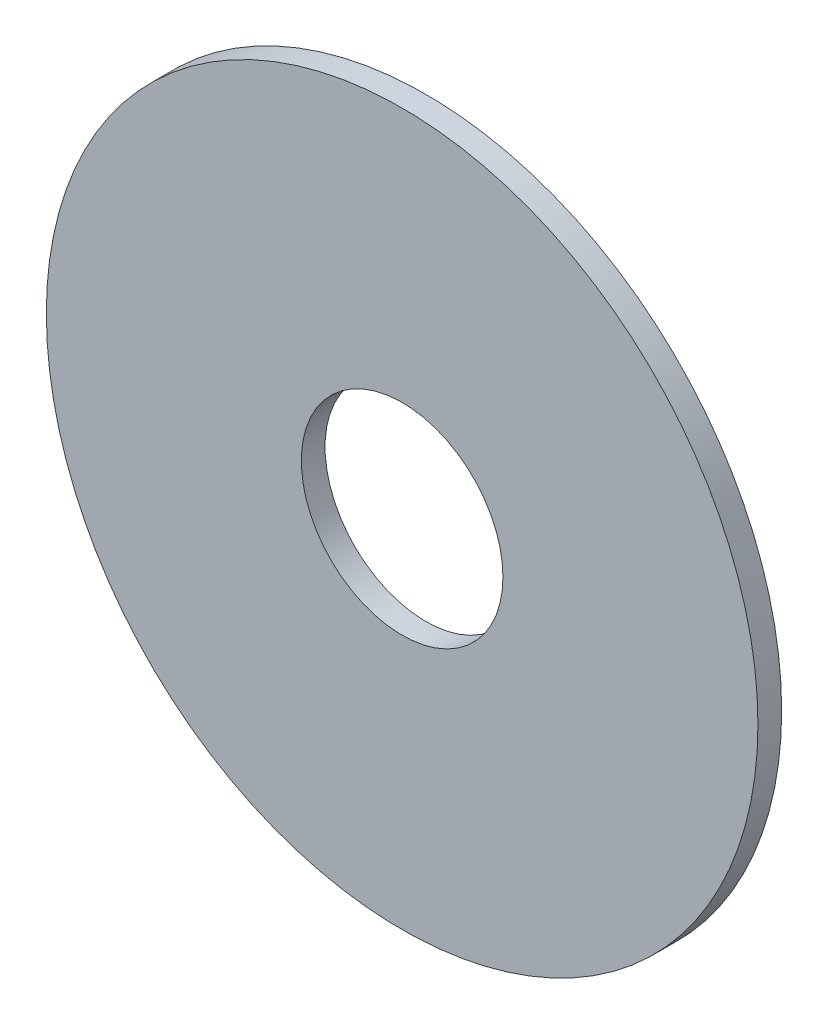
ISO-10303-21;
HEADER;
FILE_DESCRIPTION(('STEP AP214'),'2;1');
FILE_NAME('part.step','',(''),(''),'','','');
FILE_SCHEMA(('AUTOMOTIVE_DESIGN { 1 0 10303 214 1 1 1 1 }'));
ENDSEC;
DATA;
#1=APPLICATION_CONTEXT('core data for automotive mechanical design processes');
#2=APPLICATION_PROTOCOL_DEFINITION('international standard','automotive_design',2000,#1);
#3=PRODUCT_CONTEXT('',#1,'mechanical');
#4=PRODUCT('Part','Part','',(#3));
#5=PRODUCT_RELATED_PRODUCT_CATEGORY('part','',(#4));
#6=PRODUCT_DEFINITION_FORMATION('','',#4);
#7=PRODUCT_DEFINITION_CONTEXT('part definition',#1,'design');
#8=PRODUCT_DEFINITION('design','',#6,#7);
#9=PRODUCT_DEFINITION_SHAPE('','',#8);
#10=(LENGTH_UNIT() NAMED_UNIT(*) SI_UNIT(.MILLI.,.METRE.));
#11=(NAMED_UNIT(*) PLANE_ANGLE_UNIT() SI_UNIT($,.RADIAN.));
#12=(NAMED_UNIT(*) SI_UNIT($,.STERADIAN.) SOLID_ANGLE_UNIT());
#13=UNCERTAINTY_MEASURE_WITH_UNIT(LENGTH_MEASURE(1.E-05),#10,'distance_accuracy_value','');
#14=(GEOMETRIC_REPRESENTATION_CONTEXT(3) GLOBAL_UNCERTAINTY_ASSIGNED_CONTEXT((#13)) GLOBAL_UNIT_ASSIGNED_CONTEXT((#10,
#11,#12)) REPRESENTATION_CONTEXT('',''));
#15=CARTESIAN_POINT('',(0.,0.,0.));
#16=DIRECTION('',(0.,0.,1.));
#17=DIRECTION('',(1.,0.,0.));
#18=AXIS2_PLACEMENT_3D('',#15,#16,#17);
#19=CARTESIAN_POINT('',(0.,0.,1.));
#20=DIRECTION('',(0.,0.,1.));
#21=DIRECTION('',(1.,0.,0.));
#22=AXIS2_PLACEMENT_3D('',#19,#20,#21);
#23=PLANE('',#22);
#24=CARTESIAN_POINT('',(0.,0.,1.));
#25=DIRECTION('',(0.,0.,1.));
#26=DIRECTION('',(1.,0.,0.));
#27=AXIS2_PLACEMENT_3D('',#24,#25,#26);
#28=CIRCLE('',#27,15.);
#29=CARTESIAN_POINT('',(15.,0.,1.));
#30=VERTEX_POINT('',#29);
#31=EDGE_CURVE('E10',#30,#30,#28,.T.);
#32=ORIENTED_EDGE('',*,*,#31,.T.);
#33=EDGE_LOOP('',(#32));
#34=FACE_BOUND('',#33,.T.);
#35=CARTESIAN_POINT('',(0.,0.,1.));
#36=DIRECTION('',(0.,0.,1.));
#37=DIRECTION('',(1.,0.,0.));
#38=AXIS2_PLACEMENT_3D('',#35,#36,#37);
#39=CIRCLE('',#38,4.25);
#40=CARTESIAN_POINT('',(4.25,0.,1.));
#41=VERTEX_POINT('',#40);
#42=EDGE_CURVE('E50',#41,#41,#39,.T.);
#43=ORIENTED_EDGE('',*,*,#42,.F.);
#44=EDGE_LOOP('',(#43));
#45=FACE_BOUND('',#44,.T.);
#46=ADVANCED_FACE('F37',(#34,#45),#23,.T.);
#47=CARTESIAN_POINT('',(0.,0.,0.));
#48=DIRECTION('',(0.,0.,1.));
#49=DIRECTION('',(1.,0.,0.));
#50=AXIS2_PLACEMENT_3D('',#47,#48,#49);
#51=PLANE('',#50);
#52=CARTESIAN_POINT('',(0.,0.,0.));
#53=DIRECTION('',(0.,0.,1.));
#54=DIRECTION('',(1.,0.,0.));
#55=AXIS2_PLACEMENT_3D('',#52,#53,#54);
#56=CIRCLE('',#55,15.);
#57=CARTESIAN_POINT('',(15.,0.,0.));
#58=VERTEX_POINT('',#57);
#59=EDGE_CURVE('E41',#58,#58,#56,.T.);
#60=ORIENTED_EDGE('',*,*,#59,.F.);
#61=EDGE_LOOP('',(#60));
#62=FACE_BOUND('',#61,.T.);
#63=CARTESIAN_POINT('',(0.,0.,0.));
#64=DIRECTION('',(0.,0.,1.));
#65=DIRECTION('',(1.,0.,0.));
#66=AXIS2_PLACEMENT_3D('',#63,#64,#65);
#67=CIRCLE('',#66,4.25);
#68=CARTESIAN_POINT('',(4.25,0.,0.));
#69=VERTEX_POINT('',#68);
#70=EDGE_CURVE('E52',#69,#69,#67,.T.);
#71=ORIENTED_EDGE('',*,*,#70,.T.);
#72=EDGE_LOOP('',(#71));
#73=FACE_BOUND('',#72,.T.);
#74=ADVANCED_FACE('F64',(#62,#73),#51,.F.);
#75=CARTESIAN_POINT('',(0.,0.,1.));
#76=DIRECTION('',(0.,0.,-1.));
#77=DIRECTION('',(-1.,0.,0.));
#78=AXIS2_PLACEMENT_3D('',#75,#76,#77);
#79=CYLINDRICAL_SURFACE('',#78,15.);
#80=ORIENTED_EDGE('',*,*,#31,.F.);
#81=EDGE_LOOP('',(#80));
#82=FACE_BOUND('',#81,.T.);
#83=ORIENTED_EDGE('',*,*,#59,.T.);
#84=EDGE_LOOP('',(#83));
#85=FACE_BOUND('',#84,.T.);
#86=ADVANCED_FACE('F39',(#82,#85),#79,.T.);
#87=CARTESIAN_POINT('',(0.,0.,1.));
#88=DIRECTION('',(0.,0.,-1.));
#89=DIRECTION('',(-1.,0.,0.));
#90=AXIS2_PLACEMENT_3D('',#87,#88,#89);
#91=CYLINDRICAL_SURFACE('',#90,4.25);
#92=ORIENTED_EDGE('',*,*,#42,.T.);
#93=EDGE_LOOP('',(#92));
#94=FACE_BOUND('',#93,.T.);
#95=ORIENTED_EDGE('',*,*,#70,.F.);
#96=EDGE_LOOP('',(#95));
#97=FACE_BOUND('',#96,.T.);
#98=ADVANCED_FACE('F60',(#94,#97),#91,.F.);
#99=CLOSED_SHELL('',(#46,#74,#86,#98));
#100=MANIFOLD_SOLID_BREP('B2',#99);
#101=ADVANCED_BREP_SHAPE_REPRESENTATION('',(#18,#100),#14);
#102=SHAPE_DEFINITION_REPRESENTATION(#9,#101);
ENDSEC;
END-ISO-10303-21;
